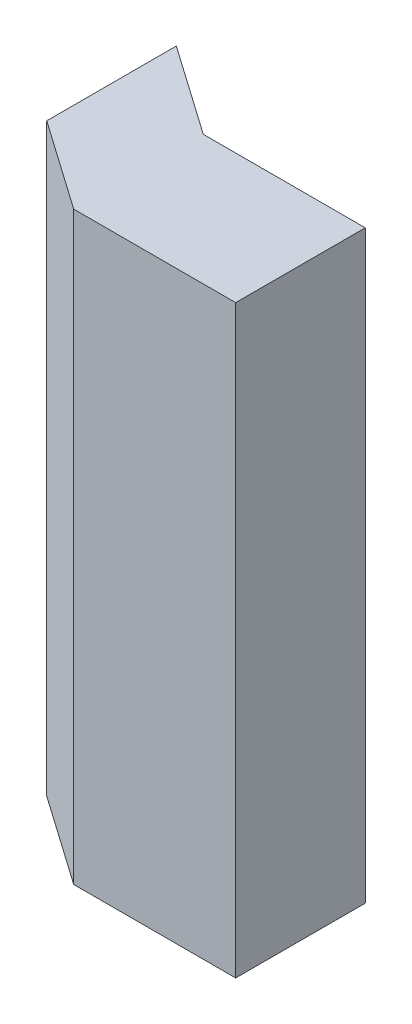
ISO-10303-21;
HEADER;
FILE_DESCRIPTION(('STEP AP214'),'2;1');
FILE_NAME('part.step','',(''),(''),'','','');
FILE_SCHEMA(('AUTOMOTIVE_DESIGN { 1 0 10303 214 1 1 1 1 }'));
ENDSEC;
DATA;
#1=APPLICATION_CONTEXT('core data for automotive mechanical design processes');
#2=APPLICATION_PROTOCOL_DEFINITION('international standard','automotive_design',2000,#1);
#3=PRODUCT_CONTEXT('',#1,'mechanical');
#4=PRODUCT('Part','Part','',(#3));
#5=PRODUCT_RELATED_PRODUCT_CATEGORY('part','',(#4));
#6=PRODUCT_DEFINITION_FORMATION('','',#4);
#7=PRODUCT_DEFINITION_CONTEXT('part definition',#1,'design');
#8=PRODUCT_DEFINITION('design','',#6,#7);
#9=PRODUCT_DEFINITION_SHAPE('','',#8);
#10=(LENGTH_UNIT() NAMED_UNIT(*) SI_UNIT(.MILLI.,.METRE.));
#11=(NAMED_UNIT(*) PLANE_ANGLE_UNIT() SI_UNIT($,.RADIAN.));
#12=(NAMED_UNIT(*) SI_UNIT($,.STERADIAN.) SOLID_ANGLE_UNIT());
#13=UNCERTAINTY_MEASURE_WITH_UNIT(LENGTH_MEASURE(1.E-05),#10,'distance_accuracy_value','');
#14=(GEOMETRIC_REPRESENTATION_CONTEXT(3) GLOBAL_UNCERTAINTY_ASSIGNED_CONTEXT((#13)) GLOBAL_UNIT_ASSIGNED_CONTEXT((#10,
#11,#12)) REPRESENTATION_CONTEXT('',''));
#15=CARTESIAN_POINT('',(0.,0.,0.));
#16=DIRECTION('',(0.,0.,1.));
#17=DIRECTION('',(1.,0.,0.));
#18=AXIS2_PLACEMENT_3D('',#15,#16,#17);
#19=CARTESIAN_POINT('',(25.22220521656,-6.48402861069336,-0.80478033065978));
#20=CARTESIAN_POINT('',(25.2222048756112,-10.3840286106934,-0.804780501134276));
#21=CARTESIAN_POINT('',(25.22220521656,-6.48402864846001,0.0592196693402176));
#22=CARTESIAN_POINT('',(25.2222048756112,-10.38402864846,0.059219498865722));
#23=(BOUNDED_SURFACE() B_SPLINE_SURFACE(1,1,((#19,#20),(#21,#22)),.UNSPECIFIED.,.F.,.F.,
.F.) B_SPLINE_SURFACE_WITH_KNOTS((2,2),(2,2),(-7.2E-05,0.000792),(-0.000325000000000004,
0.003575),.UNSPECIFIED.) GEOMETRIC_REPRESENTATION_ITEM() RATIONAL_B_SPLINE_SURFACE(((1.,1.),(1.,1.))) REPRESENTATION_ITEM('') SURFACE());
#24=CARTESIAN_POINT('',(25.2222051881476,-6.80902861384058,-0.732780344865988));
#25=CARTESIAN_POINT('',(25.2222051881476,-6.80902864531279,-0.0127803448659904));
#26=(BOUNDED_CURVE() B_SPLINE_CURVE(1,(#24,#25),.UNSPECIFIED.,.F.,
.F.) B_SPLINE_CURVE_WITH_KNOTS((2,2),(0.,0.00072),
.UNSPECIFIED.) CURVE() GEOMETRIC_REPRESENTATION_ITEM() RATIONAL_B_SPLINE_CURVE((1.,1.)) REPRESENTATION_ITEM(''));
#27=CARTESIAN_POINT('',(25.2222051881476,-6.80902861384058,-0.732780344865988));
#28=VERTEX_POINT('',#27);
#29=CARTESIAN_POINT('',(25.2222051881476,-6.8090286453128,-0.0127803448659904));
#30=VERTEX_POINT('',#29);
#31=EDGE_CURVE('E89',#28,#30,#26,.T.);
#32=CARTESIAN_POINT('',(25.2222051881476,-6.8090286453128,-0.0127803448659904));
#33=CARTESIAN_POINT('',(25.2222049040236,-10.0590286453128,-0.0127804869280701));
#34=(BOUNDED_CURVE() B_SPLINE_CURVE(1,(#32,#33),.UNSPECIFIED.,.F.,
.F.) B_SPLINE_CURVE_WITH_KNOTS((2,2),(0.,0.00325),
.UNSPECIFIED.) CURVE() GEOMETRIC_REPRESENTATION_ITEM() RATIONAL_B_SPLINE_CURVE((1.,1.)) REPRESENTATION_ITEM(''));
#35=CARTESIAN_POINT('',(25.2222049040235,-10.0590286453128,-0.0127804869280699));
#36=VERTEX_POINT('',#35);
#37=EDGE_CURVE('E32',#30,#36,#34,.T.);
#38=CARTESIAN_POINT('',(25.2222049040235,-10.0590286138406,-0.732780486928068));
#39=CARTESIAN_POINT('',(25.2222049040235,-10.0590286453128,-0.01278048692807));
#40=(BOUNDED_CURVE() B_SPLINE_CURVE(1,(#38,#39),.UNSPECIFIED.,.F.,
.F.) B_SPLINE_CURVE_WITH_KNOTS((2,2),(0.,0.00072),
.UNSPECIFIED.) CURVE() GEOMETRIC_REPRESENTATION_ITEM() RATIONAL_B_SPLINE_CURVE((1.,1.)) REPRESENTATION_ITEM(''));
#41=CARTESIAN_POINT('',(25.2222049040235,-10.0590286138406,-0.732780486928068));
#42=VERTEX_POINT('',#41);
#43=EDGE_CURVE('E131',#42,#36,#40,.T.);
#44=CARTESIAN_POINT('',(25.2222051881476,-6.80902861384058,-0.732780344865988));
#45=CARTESIAN_POINT('',(25.2222049040236,-10.0590286138406,-0.732780486928068));
#46=(BOUNDED_CURVE() B_SPLINE_CURVE(1,(#44,#45),.UNSPECIFIED.,.F.,
.F.) B_SPLINE_CURVE_WITH_KNOTS((2,2),(0.,0.00325),
.UNSPECIFIED.) CURVE() GEOMETRIC_REPRESENTATION_ITEM() RATIONAL_B_SPLINE_CURVE((1.,1.)) REPRESENTATION_ITEM(''));
#47=EDGE_CURVE('E11',#28,#42,#46,.T.);
#48=ORIENTED_EDGE('',*,*,#31,.T.);
#49=ORIENTED_EDGE('',*,*,#37,.T.);
#50=ORIENTED_EDGE('',*,*,#43,.F.);
#51=ORIENTED_EDGE('',*,*,#47,.F.);
#52=EDGE_LOOP('',(#48,#49,#50,#51));
#53=FACE_BOUND('',#52,.T.);
#54=ADVANCED_FACE('F17',(#53),#23,.T.);
#55=CARTESIAN_POINT('',(24.2322052165599,-6.48402852729203,-0.732780330659772));
#56=CARTESIAN_POINT('',(24.2322048756111,-10.3840285272921,-0.732780501134268));
#57=CARTESIAN_POINT('',(25.31220521656,-6.48402862170863,-0.732780330659781));
#58=CARTESIAN_POINT('',(25.3122048756112,-10.3840286217086,-0.732780501134276));
#59=(BOUNDED_SURFACE() B_SPLINE_SURFACE(1,1,((#55,#56),(#57,#58)),.UNSPECIFIED.,.F.,.F.,
.F.) B_SPLINE_SURFACE_WITH_KNOTS((2,2),(2,2),(-9.00000000000129E-05,0.00099000000000012),
(-0.000325000000000004,0.003575),
.UNSPECIFIED.) GEOMETRIC_REPRESENTATION_ITEM() RATIONAL_B_SPLINE_SURFACE(((1.,1.),(1.,1.))) REPRESENTATION_ITEM('') SURFACE());
#60=CARTESIAN_POINT('',(24.3222051881475,-6.80902853516008,-0.732780344865981));
#61=CARTESIAN_POINT('',(25.2222051881476,-6.80902861384058,-0.732780344865988));
#62=(BOUNDED_CURVE() B_SPLINE_CURVE(1,(#60,#61),.UNSPECIFIED.,.F.,
.F.) B_SPLINE_CURVE_WITH_KNOTS((2,2),(0.,0.000900000000000101),
.UNSPECIFIED.) CURVE() GEOMETRIC_REPRESENTATION_ITEM() RATIONAL_B_SPLINE_CURVE((1.,1.)) REPRESENTATION_ITEM(''));
#63=CARTESIAN_POINT('',(24.3222051881475,-6.80902853516008,-0.732780344865981));
#64=VERTEX_POINT('',#63);
#65=EDGE_CURVE('E92',#64,#28,#62,.T.);
#66=CARTESIAN_POINT('',(24.3222049040236,-10.0590285351601,-0.732780486928061));
#67=CARTESIAN_POINT('',(25.2222049040235,-10.0590286138406,-0.732780486928068));
#68=(BOUNDED_CURVE() B_SPLINE_CURVE(1,(#66,#67),.UNSPECIFIED.,.F.,
.F.) B_SPLINE_CURVE_WITH_KNOTS((2,2),(0.,0.000899999999999901),
.UNSPECIFIED.) CURVE() GEOMETRIC_REPRESENTATION_ITEM() RATIONAL_B_SPLINE_CURVE((1.,1.)) REPRESENTATION_ITEM(''));
#69=CARTESIAN_POINT('',(24.3222049040236,-10.0590285351601,-0.732780486928061));
#70=VERTEX_POINT('',#69);
#71=EDGE_CURVE('E122',#70,#42,#68,.T.);
#72=CARTESIAN_POINT('',(24.3222051881475,-6.80902853516008,-0.732780344865981));
#73=CARTESIAN_POINT('',(24.3222049040235,-10.0590285351601,-0.732780486928061));
#74=(BOUNDED_CURVE() B_SPLINE_CURVE(1,(#72,#73),.UNSPECIFIED.,.F.,
.F.) B_SPLINE_CURVE_WITH_KNOTS((2,2),(0.,0.00325),
.UNSPECIFIED.) CURVE() GEOMETRIC_REPRESENTATION_ITEM() RATIONAL_B_SPLINE_CURVE((1.,1.)) REPRESENTATION_ITEM(''));
#75=EDGE_CURVE('E64',#64,#70,#74,.T.);
#76=ORIENTED_EDGE('',*,*,#65,.T.);
#77=ORIENTED_EDGE('',*,*,#47,.T.);
#78=ORIENTED_EDGE('',*,*,#71,.F.);
#79=ORIENTED_EDGE('',*,*,#75,.F.);
#80=EDGE_LOOP('',(#76,#77,#78,#79));
#81=FACE_BOUND('',#80,.T.);
#82=ADVANCED_FACE('F236',(#81),#59,.T.);
#83=CARTESIAN_POINT('',(25.31220521656,-6.48402865318085,-0.0127803306597831));
#84=CARTESIAN_POINT('',(25.3122048756112,-10.3840286531809,-0.0127805011342787));
#85=CARTESIAN_POINT('',(24.23220521656,-6.48402855876425,-0.0127803306597749));
#86=CARTESIAN_POINT('',(24.2322048756112,-10.3840285587643,-0.0127805011342705));
#87=(BOUNDED_SURFACE() B_SPLINE_SURFACE(1,1,((#83,#84),(#85,#86)),.UNSPECIFIED.,.F.,.F.,
.F.) B_SPLINE_SURFACE_WITH_KNOTS((2,2),(2,2),(-9.0000000000008E-05,0.00099),(-0.000325,
0.003575),.UNSPECIFIED.) GEOMETRIC_REPRESENTATION_ITEM() RATIONAL_B_SPLINE_SURFACE(((1.,1.),(1.,1.))) REPRESENTATION_ITEM('') SURFACE());
#88=CARTESIAN_POINT('',(25.2222051881476,-6.8090286453128,-0.0127803448659904));
#89=CARTESIAN_POINT('',(24.3222051881476,-6.8090285666323,-0.0127803448659835));
#90=(BOUNDED_CURVE() B_SPLINE_CURVE(1,(#88,#89),.UNSPECIFIED.,.F.,
.F.) B_SPLINE_CURVE_WITH_KNOTS((2,2),(0.,0.0009),
.UNSPECIFIED.) CURVE() GEOMETRIC_REPRESENTATION_ITEM() RATIONAL_B_SPLINE_CURVE((1.,1.)) REPRESENTATION_ITEM(''));
#91=CARTESIAN_POINT('',(24.3222051881476,-6.80902856663231,-0.0127803448659834));
#92=VERTEX_POINT('',#91);
#93=EDGE_CURVE('E81',#30,#92,#90,.T.);
#94=CARTESIAN_POINT('',(24.3222051881476,-6.80902856663231,-0.0127803448659834));
#95=CARTESIAN_POINT('',(24.3222049040236,-10.0590285666323,-0.0127804869280631));
#96=(BOUNDED_CURVE() B_SPLINE_CURVE(1,(#94,#95),.UNSPECIFIED.,.F.,
.F.) B_SPLINE_CURVE_WITH_KNOTS((2,2),(0.,0.00325),
.UNSPECIFIED.) CURVE() GEOMETRIC_REPRESENTATION_ITEM() RATIONAL_B_SPLINE_CURVE((1.,1.)) REPRESENTATION_ITEM(''));
#97=CARTESIAN_POINT('',(24.3222049040236,-10.0590285666323,-0.012780486928063));
#98=VERTEX_POINT('',#97);
#99=EDGE_CURVE('E139',#92,#98,#96,.T.);
#100=CARTESIAN_POINT('',(25.2222049040235,-10.0590286453128,-0.0127804869280699));
#101=CARTESIAN_POINT('',(24.3222049040236,-10.0590285666323,-0.012780486928063));
#102=(BOUNDED_CURVE() B_SPLINE_CURVE(1,(#100,#101),.UNSPECIFIED.,.F.,
.F.) B_SPLINE_CURVE_WITH_KNOTS((2,2),(0.,0.000899999999999901),
.UNSPECIFIED.) CURVE() GEOMETRIC_REPRESENTATION_ITEM() RATIONAL_B_SPLINE_CURVE((1.,1.)) REPRESENTATION_ITEM(''));
#103=EDGE_CURVE('E84',#36,#98,#102,.T.);
#104=ORIENTED_EDGE('',*,*,#93,.T.);
#105=ORIENTED_EDGE('',*,*,#99,.T.);
#106=ORIENTED_EDGE('',*,*,#103,.F.);
#107=ORIENTED_EDGE('',*,*,#37,.F.);
#108=EDGE_LOOP('',(#104,#105,#106,#107));
#109=FACE_BOUND('',#108,.T.);
#110=ADVANCED_FACE('F79',(#109),#87,.T.);
#111=CARTESIAN_POINT('',(23.772368233964,-6.48402847026291,-1.11778033065978));
#112=CARTESIAN_POINT('',(23.7723678930152,-10.3840284702629,-1.11778050113428));
#113=CARTESIAN_POINT('',(24.3721903967959,-6.48402854105982,-0.69778033065965));
#114=CARTESIAN_POINT('',(24.3721900558471,-10.3840285410598,-0.697780501134146));
#115=(BOUNDED_SURFACE() B_SPLINE_SURFACE(1,1,((#111,#112),(#113,#114)),.UNSPECIFIED.,.F.,.F.,
.F.) B_SPLINE_SURFACE_WITH_KNOTS((2,2),(2,2),(-6.10206378467642E-05,0.000671227016314383),
(-0.000325000000000009,0.003575),
.UNSPECIFIED.) GEOMETRIC_REPRESENTATION_ITEM() RATIONAL_B_SPLINE_SURFACE(((1.,1.),(1.,1.))) REPRESENTATION_ITEM('') SURFACE());
#116=CARTESIAN_POINT('',(23.8223533857876,-6.80902847616266,-1.08278034486598));
#117=CARTESIAN_POINT('',(24.3222051881475,-6.80902853516009,-0.732780344865931));
#118=(BOUNDED_CURVE() B_SPLINE_CURVE(1,(#116,#117),.UNSPECIFIED.,.F.,
.F.) B_SPLINE_CURVE_WITH_KNOTS((2,2),(0.,0.000610206378467515),
.UNSPECIFIED.) CURVE() GEOMETRIC_REPRESENTATION_ITEM() RATIONAL_B_SPLINE_CURVE((1.,1.)) REPRESENTATION_ITEM(''));
#119=CARTESIAN_POINT('',(23.8223533857876,-6.80902847616266,-1.08278034486598));
#120=VERTEX_POINT('',#119);
#121=EDGE_CURVE('E213',#120,#64,#118,.T.);
#122=CARTESIAN_POINT('',(23.8223531016636,-10.0590284761626,-1.08278048692806));
#123=CARTESIAN_POINT('',(24.3222049040235,-10.05902853516,-0.732780486927961));
#124=(BOUNDED_CURVE() B_SPLINE_CURVE(1,(#122,#123),.UNSPECIFIED.,.F.,
.F.) B_SPLINE_CURVE_WITH_KNOTS((2,2),(0.,0.000610206378467602),
.UNSPECIFIED.) CURVE() GEOMETRIC_REPRESENTATION_ITEM() RATIONAL_B_SPLINE_CURVE((1.,1.)) REPRESENTATION_ITEM(''));
#125=CARTESIAN_POINT('',(23.8223531016636,-10.0590284761626,-1.08278048692806));
#126=VERTEX_POINT('',#125);
#127=EDGE_CURVE('E120',#126,#70,#124,.T.);
#128=CARTESIAN_POINT('',(23.8223533857876,-6.80902847616266,-1.08278034486598));
#129=CARTESIAN_POINT('',(23.8223531016636,-10.0590284761626,-1.08278048692806));
#130=(BOUNDED_CURVE() B_SPLINE_CURVE(1,(#128,#129),.UNSPECIFIED.,.F.,
.F.) B_SPLINE_CURVE_WITH_KNOTS((2,2),(0.,0.00324999999999994),
.UNSPECIFIED.) CURVE() GEOMETRIC_REPRESENTATION_ITEM() RATIONAL_B_SPLINE_CURVE((1.,1.)) REPRESENTATION_ITEM(''));
#131=EDGE_CURVE('E23',#120,#126,#130,.T.);
#132=ORIENTED_EDGE('',*,*,#121,.T.);
#133=ORIENTED_EDGE('',*,*,#75,.T.);
#134=ORIENTED_EDGE('',*,*,#127,.F.);
#135=ORIENTED_EDGE('',*,*,#131,.F.);
#136=EDGE_LOOP('',(#132,#133,#134,#135));
#137=FACE_BOUND('',#136,.T.);
#138=ADVANCED_FACE('F235',(#137),#115,.T.);
#139=CARTESIAN_POINT('',(23.8223534142,-6.48402851078209,-0.29078033065977));
#140=CARTESIAN_POINT('',(23.8223530732512,-10.3840285107821,-0.290780501134265));
#141=CARTESIAN_POINT('',(23.8223534142,-6.48402847301543,-1.15478033065977));
#142=CARTESIAN_POINT('',(23.8223530732512,-10.3840284730155,-1.15478050113427));
#143=(BOUNDED_SURFACE() B_SPLINE_SURFACE(1,1,((#139,#140),(#141,#142)),.UNSPECIFIED.,.F.,.F.,
.F.) B_SPLINE_SURFACE_WITH_KNOTS((2,2),(2,2),(-7.2E-05,0.000792),(-0.000325000000000005,
0.00357500000000005),
.UNSPECIFIED.) GEOMETRIC_REPRESENTATION_ITEM() RATIONAL_B_SPLINE_SURFACE(((1.,1.),(1.,1.))) REPRESENTATION_ITEM('') SURFACE());
#144=CARTESIAN_POINT('',(23.8223533857876,-6.80902850763487,-0.362780344865978));
#145=CARTESIAN_POINT('',(23.8223533857876,-6.80902847616266,-1.08278034486598));
#146=(BOUNDED_CURVE() B_SPLINE_CURVE(1,(#144,#145),.UNSPECIFIED.,.F.,
.F.) B_SPLINE_CURVE_WITH_KNOTS((2,2),(0.,0.00072),
.UNSPECIFIED.) CURVE() GEOMETRIC_REPRESENTATION_ITEM() RATIONAL_B_SPLINE_CURVE((1.,1.)) REPRESENTATION_ITEM(''));
#147=CARTESIAN_POINT('',(23.8223533857876,-6.80902850763487,-0.362780344865978));
#148=VERTEX_POINT('',#147);
#149=EDGE_CURVE('E104',#148,#120,#146,.T.);
#150=CARTESIAN_POINT('',(23.8223531016636,-10.0590285076349,-0.362780486928059));
#151=CARTESIAN_POINT('',(23.8223531016636,-10.0590284761627,-1.08278048692806));
#152=(BOUNDED_CURVE() B_SPLINE_CURVE(1,(#150,#151),.UNSPECIFIED.,.F.,
.F.) B_SPLINE_CURVE_WITH_KNOTS((2,2),(0.,0.00072),
.UNSPECIFIED.) CURVE() GEOMETRIC_REPRESENTATION_ITEM() RATIONAL_B_SPLINE_CURVE((1.,1.)) REPRESENTATION_ITEM(''));
#153=CARTESIAN_POINT('',(23.8223531016636,-10.0590285076349,-0.362780486928059));
#154=VERTEX_POINT('',#153);
#155=EDGE_CURVE('E111',#154,#126,#152,.T.);
#156=CARTESIAN_POINT('',(23.8223533857876,-6.80902850763487,-0.362780344865978));
#157=CARTESIAN_POINT('',(23.8223531016636,-10.0590285076349,-0.362780486928058));
#158=(BOUNDED_CURVE() B_SPLINE_CURVE(1,(#156,#157),.UNSPECIFIED.,.F.,
.F.) B_SPLINE_CURVE_WITH_KNOTS((2,2),(0.,0.00325),
.UNSPECIFIED.) CURVE() GEOMETRIC_REPRESENTATION_ITEM() RATIONAL_B_SPLINE_CURVE((1.,1.)) REPRESENTATION_ITEM(''));
#159=EDGE_CURVE('E146',#148,#154,#158,.T.);
#160=ORIENTED_EDGE('',*,*,#149,.T.);
#161=ORIENTED_EDGE('',*,*,#131,.T.);
#162=ORIENTED_EDGE('',*,*,#155,.F.);
#163=ORIENTED_EDGE('',*,*,#159,.F.);
#164=EDGE_LOOP('',(#160,#161,#162,#163));
#165=FACE_BOUND('',#164,.T.);
#166=ADVANCED_FACE('F335',(#165),#143,.T.);
#167=CARTESIAN_POINT('',(24.372190396796,-6.48402857253204,0.0222196693402463));
#168=CARTESIAN_POINT('',(24.3721900558472,-10.3840285725321,0.0222194988657507));
#169=CARTESIAN_POINT('',(23.7723682339641,-6.48402850173512,-0.397780330659885));
#170=CARTESIAN_POINT('',(23.7723678930153,-10.3840285017352,-0.397780501134381));
#171=(BOUNDED_SURFACE() B_SPLINE_SURFACE(1,1,((#167,#168),(#169,#170)),.UNSPECIFIED.,.F.,.F.,
.F.) B_SPLINE_SURFACE_WITH_KNOTS((2,2),(2,2),(-6.10206378467807E-05,0.000671227016314361),
(-0.000325000000000018,0.003575),
.UNSPECIFIED.) GEOMETRIC_REPRESENTATION_ITEM() RATIONAL_B_SPLINE_SURFACE(((1.,1.),(1.,1.))) REPRESENTATION_ITEM('') SURFACE());
#172=CARTESIAN_POINT('',(24.3222051881476,-6.80902856663231,-0.0127803448659834));
#173=CARTESIAN_POINT('',(23.8223533857877,-6.80902850763488,-0.362780344866078));
#174=(BOUNDED_CURVE() B_SPLINE_CURVE(1,(#172,#173),.UNSPECIFIED.,.F.,
.F.) B_SPLINE_CURVE_WITH_KNOTS((2,2),(0.,0.000610206378467596),
.UNSPECIFIED.) CURVE() GEOMETRIC_REPRESENTATION_ITEM() RATIONAL_B_SPLINE_CURVE((1.,1.)) REPRESENTATION_ITEM(''));
#175=EDGE_CURVE('E97',#92,#148,#174,.T.);
#176=CARTESIAN_POINT('',(24.3222049040236,-10.0590285666323,-0.012780486928063));
#177=CARTESIAN_POINT('',(23.8223531016637,-10.0590285076349,-0.362780486928161));
#178=(BOUNDED_CURVE() B_SPLINE_CURVE(1,(#176,#177),.UNSPECIFIED.,.F.,
.F.) B_SPLINE_CURVE_WITH_KNOTS((2,2),(0.,0.0006102063784676),
.UNSPECIFIED.) CURVE() GEOMETRIC_REPRESENTATION_ITEM() RATIONAL_B_SPLINE_CURVE((1.,1.)) REPRESENTATION_ITEM(''));
#179=EDGE_CURVE('E121',#98,#154,#178,.T.);
#180=ORIENTED_EDGE('',*,*,#175,.T.);
#181=ORIENTED_EDGE('',*,*,#159,.T.);
#182=ORIENTED_EDGE('',*,*,#179,.F.);
#183=ORIENTED_EDGE('',*,*,#99,.F.);
#184=EDGE_LOOP('',(#180,#181,#182,#183));
#185=FACE_BOUND('',#184,.T.);
#186=ADVANCED_FACE('F237',(#185),#171,.T.);
#187=CARTESIAN_POINT('',(25.3621900842595,-10.0590286622278,0.0942195130719294));
#188=CARTESIAN_POINT('',(25.3621900842595,-10.0590286061024,-1.18978048692807));
#189=CARTESIAN_POINT('',(23.6823679214276,-10.0590285153731,0.0942195130719422));
#190=CARTESIAN_POINT('',(23.6823679214276,-10.0590284592477,-1.18978048692806));
#191=(BOUNDED_SURFACE() B_SPLINE_SURFACE(1,1,((#187,#188),(#189,#190)),.UNSPECIFIED.,.F.,.F.,
.F.) B_SPLINE_SURFACE_WITH_KNOTS((2,2),(2,2),(-0.001289911081416,0.000389911081415898),
(-0.000642,0.000642),
.UNSPECIFIED.) GEOMETRIC_REPRESENTATION_ITEM() RATIONAL_B_SPLINE_SURFACE(((1.,1.),(1.,1.))) REPRESENTATION_ITEM('') SURFACE());
#192=ORIENTED_EDGE('',*,*,#179,.T.);
#193=ORIENTED_EDGE('',*,*,#155,.T.);
#194=ORIENTED_EDGE('',*,*,#127,.T.);
#195=ORIENTED_EDGE('',*,*,#71,.T.);
#196=ORIENTED_EDGE('',*,*,#43,.T.);
#197=ORIENTED_EDGE('',*,*,#103,.T.);
#198=EDGE_LOOP('',(#192,#193,#194,#195,#196,#197));
#199=FACE_BOUND('',#198,.T.);
#200=ADVANCED_FACE('F234',(#199),#191,.T.);
#201=CARTESIAN_POINT('',(23.6823682055516,-6.80902851537309,0.0942196551340216));
#202=CARTESIAN_POINT('',(23.6823682055516,-6.80902845924764,-1.18978034486598));
#203=CARTESIAN_POINT('',(25.3621903683836,-6.80902866222781,0.0942196551340087));
#204=CARTESIAN_POINT('',(25.3621903683836,-6.80902860610236,-1.18978034486599));
#205=(BOUNDED_SURFACE() B_SPLINE_SURFACE(1,1,((#201,#202),(#203,#204)),.UNSPECIFIED.,.F.,.F.,
.F.) B_SPLINE_SURFACE_WITH_KNOTS((2,2),(2,2),(-0.00128991108141601,0.000389911081416005),
(-0.000642,0.000642),
.UNSPECIFIED.) GEOMETRIC_REPRESENTATION_ITEM() RATIONAL_B_SPLINE_SURFACE(((1.,1.),(1.,1.))) REPRESENTATION_ITEM('') SURFACE());
#206=ORIENTED_EDGE('',*,*,#121,.F.);
#207=ORIENTED_EDGE('',*,*,#149,.F.);
#208=ORIENTED_EDGE('',*,*,#175,.F.);
#209=ORIENTED_EDGE('',*,*,#93,.F.);
#210=ORIENTED_EDGE('',*,*,#31,.F.);
#211=ORIENTED_EDGE('',*,*,#65,.F.);
#212=EDGE_LOOP('',(#206,#207,#208,#209,#210,#211));
#213=FACE_BOUND('',#212,.T.);
#214=ADVANCED_FACE('F19',(#213),#205,.T.);
#215=CLOSED_SHELL('',(#54,#82,#110,#138,#166,#186,#200,#214));
#216=MANIFOLD_SOLID_BREP('B1',#215);
#217=ADVANCED_BREP_SHAPE_REPRESENTATION('',(#18,#216),#14);
#218=SHAPE_DEFINITION_REPRESENTATION(#9,#217);
ENDSEC;
END-ISO-10303-21;
